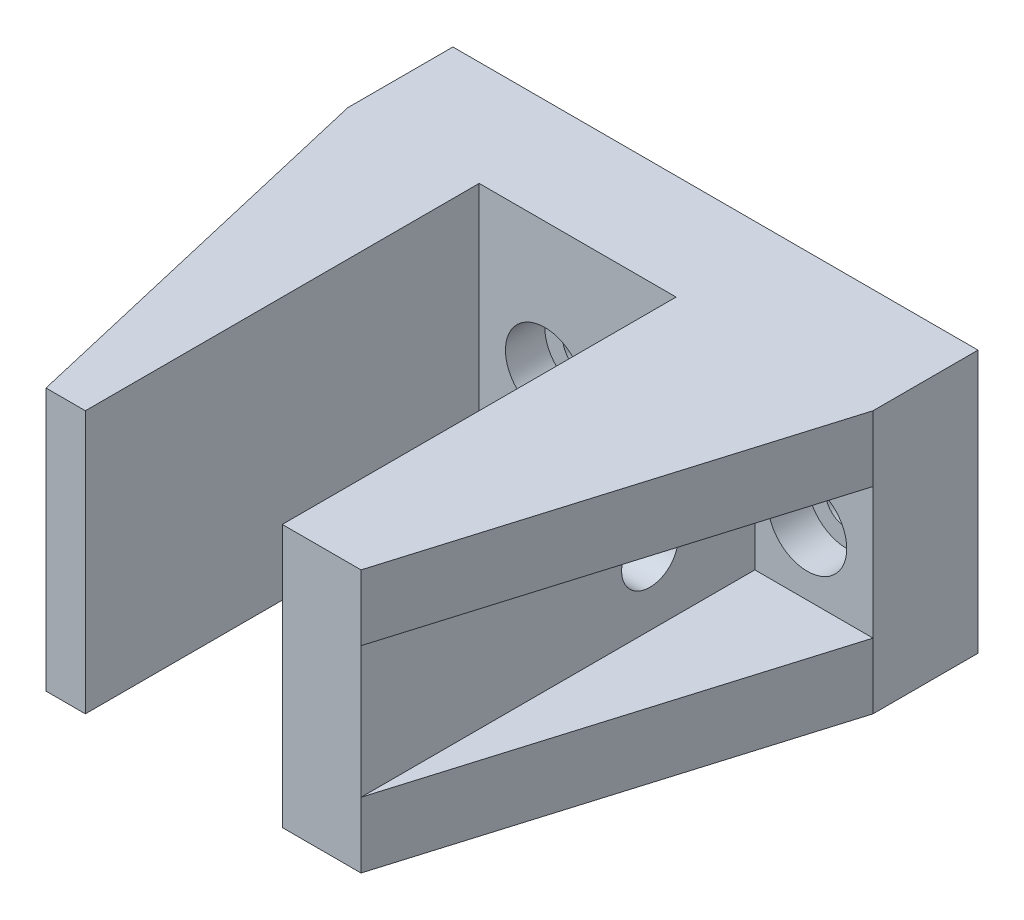
ISO-10303-21;
HEADER;
FILE_DESCRIPTION(('STEP AP214'),'2;1');
FILE_NAME('part.step','',(''),(''),'','','');
FILE_SCHEMA(('AUTOMOTIVE_DESIGN { 1 0 10303 214 1 1 1 1 }'));
ENDSEC;
DATA;
#1=APPLICATION_CONTEXT('core data for automotive mechanical design processes');
#2=APPLICATION_PROTOCOL_DEFINITION('international standard','automotive_design',2000,#1);
#3=PRODUCT_CONTEXT('',#1,'mechanical');
#4=PRODUCT('Part','Part','',(#3));
#5=PRODUCT_RELATED_PRODUCT_CATEGORY('part','',(#4));
#6=PRODUCT_DEFINITION_FORMATION('','',#4);
#7=PRODUCT_DEFINITION_CONTEXT('part definition',#1,'design');
#8=PRODUCT_DEFINITION('design','',#6,#7);
#9=PRODUCT_DEFINITION_SHAPE('','',#8);
#10=(LENGTH_UNIT() NAMED_UNIT(*) SI_UNIT(.MILLI.,.METRE.));
#11=(NAMED_UNIT(*) PLANE_ANGLE_UNIT() SI_UNIT($,.RADIAN.));
#12=(NAMED_UNIT(*) SI_UNIT($,.STERADIAN.) SOLID_ANGLE_UNIT());
#13=UNCERTAINTY_MEASURE_WITH_UNIT(LENGTH_MEASURE(1.E-05),#10,'distance_accuracy_value','');
#14=(GEOMETRIC_REPRESENTATION_CONTEXT(3) GLOBAL_UNCERTAINTY_ASSIGNED_CONTEXT((#13)) GLOBAL_UNIT_ASSIGNED_CONTEXT((#10,
#11,#12)) REPRESENTATION_CONTEXT('',''));
#15=CARTESIAN_POINT('',(0.,0.,0.));
#16=DIRECTION('',(0.,0.,1.));
#17=DIRECTION('',(1.,0.,0.));
#18=AXIS2_PLACEMENT_3D('',#15,#16,#17);
#19=CARTESIAN_POINT('',(-5.,0.,8.));
#20=DIRECTION('',(0.,0.,-1.));
#21=DIRECTION('',(-1.,0.,0.));
#22=AXIS2_PLACEMENT_3D('',#19,#20,#21);
#23=CYLINDRICAL_SURFACE('',#22,1.65);
#24=CARTESIAN_POINT('',(-5.,0.,0.));
#25=DIRECTION('',(0.,0.,1.));
#26=DIRECTION('',(1.,0.,0.));
#27=AXIS2_PLACEMENT_3D('',#24,#25,#26);
#28=CIRCLE('',#27,1.65);
#29=CARTESIAN_POINT('',(-3.35,0.,0.));
#30=VERTEX_POINT('',#29);
#31=EDGE_CURVE('E399',#30,#30,#28,.T.);
#32=ORIENTED_EDGE('',*,*,#31,.F.);
#33=EDGE_LOOP('',(#32));
#34=FACE_BOUND('',#33,.T.);
#35=CARTESIAN_POINT('',(-5.,0.,5.));
#36=DIRECTION('',(0.,0.,1.));
#37=DIRECTION('',(1.,0.,0.));
#38=AXIS2_PLACEMENT_3D('',#35,#36,#37);
#39=CIRCLE('',#38,1.65);
#40=CARTESIAN_POINT('',(-3.35,0.,5.));
#41=VERTEX_POINT('',#40);
#42=EDGE_CURVE('E49',#41,#41,#39,.T.);
#43=ORIENTED_EDGE('',*,*,#42,.T.);
#44=EDGE_LOOP('',(#43));
#45=FACE_BOUND('',#44,.T.);
#46=ADVANCED_FACE('F45',(#34,#45),#23,.F.);
#47=CARTESIAN_POINT('',(14.9997781888357,-0.0941934040751454,8.));
#48=DIRECTION('',(0.,0.,-1.));
#49=DIRECTION('',(-1.,0.,0.));
#50=AXIS2_PLACEMENT_3D('',#47,#48,#49);
#51=CYLINDRICAL_SURFACE('',#50,1.65);
#52=CARTESIAN_POINT('',(14.9997781888357,-0.0941934040751454,0.));
#53=DIRECTION('',(0.,0.,1.));
#54=DIRECTION('',(1.,0.,0.));
#55=AXIS2_PLACEMENT_3D('',#52,#53,#54);
#56=CIRCLE('',#55,1.65);
#57=CARTESIAN_POINT('',(16.6497781888357,-0.0941934040751454,0.));
#58=VERTEX_POINT('',#57);
#59=EDGE_CURVE('E395',#58,#58,#56,.T.);
#60=ORIENTED_EDGE('',*,*,#59,.F.);
#61=EDGE_LOOP('',(#60));
#62=FACE_BOUND('',#61,.T.);
#63=CARTESIAN_POINT('',(14.9997781888357,-0.0941934040751454,5.));
#64=DIRECTION('',(0.,0.,1.));
#65=DIRECTION('',(1.,0.,0.));
#66=AXIS2_PLACEMENT_3D('',#63,#64,#65);
#67=CIRCLE('',#66,1.65);
#68=CARTESIAN_POINT('',(16.6497781888357,-0.0941934040751454,5.));
#69=VERTEX_POINT('',#68);
#70=EDGE_CURVE('E459',#69,#69,#67,.T.);
#71=ORIENTED_EDGE('',*,*,#70,.T.);
#72=EDGE_LOOP('',(#71));
#73=FACE_BOUND('',#72,.T.);
#74=ADVANCED_FACE('F502',(#62,#73),#51,.F.);
#75=CARTESIAN_POINT('',(-1.0811183182043,0.,16.));
#76=DIRECTION('',(1.,0.,0.));
#77=DIRECTION('',(0.,1.,0.));
#78=AXIS2_PLACEMENT_3D('',#75,#76,#77);
#79=CYLINDRICAL_SURFACE('',#78,2.15);
#80=CARTESIAN_POINT('',(11.,0.,16.));
#81=DIRECTION('',(1.,0.,0.));
#82=DIRECTION('',(0.,1.,0.));
#83=AXIS2_PLACEMENT_3D('',#80,#81,#82);
#84=CIRCLE('',#83,2.15);
#85=CARTESIAN_POINT('',(11.,2.15,16.));
#86=VERTEX_POINT('',#85);
#87=EDGE_CURVE('E274',#86,#86,#84,.T.);
#88=ORIENTED_EDGE('',*,*,#87,.T.);
#89=EDGE_LOOP('',(#88));
#90=FACE_BOUND('',#89,.T.);
#91=CARTESIAN_POINT('',(7.5,0.,16.));
#92=DIRECTION('',(-1.,0.,0.));
#93=DIRECTION('',(0.,0.,1.));
#94=AXIS2_PLACEMENT_3D('',#91,#92,#93);
#95=CIRCLE('',#94,2.15);
#96=CARTESIAN_POINT('',(7.5,0.,18.15));
#97=VERTEX_POINT('',#96);
#98=EDGE_CURVE('E262',#97,#97,#95,.F.);
#99=ORIENTED_EDGE('',*,*,#98,.F.);
#100=EDGE_LOOP('',(#99));
#101=FACE_BOUND('',#100,.T.);
#102=ADVANCED_FACE('F508',(#90,#101),#79,.F.);
#103=CARTESIAN_POINT('',(-20.,-41.3209195267317,8.));
#104=DIRECTION('',(-0.973841209741793,0.,0.227229615606418));
#105=DIRECTION('',(0.227229615606418,0.,0.973841209741793));
#106=AXIS2_PLACEMENT_3D('',#103,#104,#105);
#107=PLANE('',#106);
#108=DIRECTION('',(0.227229615606418,0.,0.973841209741793));
#109=VECTOR('',#108,1.);
#110=CARTESIAN_POINT('',(-20.,-5.,8.));
#111=LINE('',#110,#109);
#112=CARTESIAN_POINT('',(-20.,-5.00000000000001,8.));
#113=VERTEX_POINT('',#112);
#114=CARTESIAN_POINT('',(-13.,-5.00000000000001,38.));
#115=VERTEX_POINT('',#114);
#116=EDGE_CURVE('E11',#113,#115,#111,.T.);
#117=ORIENTED_EDGE('',*,*,#116,.F.);
#118=DIRECTION('',(0.,-1.,0.));
#119=VECTOR('',#118,1.);
#120=CARTESIAN_POINT('',(-20.,-10.,8.));
#121=LINE('',#120,#119);
#122=CARTESIAN_POINT('',(-20.,-10.,8.));
#123=VERTEX_POINT('',#122);
#124=EDGE_CURVE('E409',#113,#123,#121,.T.);
#125=ORIENTED_EDGE('',*,*,#124,.T.);
#126=DIRECTION('',(-0.227229615606418,0.,-0.973841209741793));
#127=VECTOR('',#126,1.);
#128=CARTESIAN_POINT('',(-20.,-10.,8.));
#129=LINE('',#128,#127);
#130=CARTESIAN_POINT('',(-13.,-9.99999999999999,38.));
#131=VERTEX_POINT('',#130);
#132=EDGE_CURVE('E336',#131,#123,#129,.T.);
#133=ORIENTED_EDGE('',*,*,#132,.F.);
#134=DIRECTION('',(0.,-1.,0.));
#135=VECTOR('',#134,1.);
#136=CARTESIAN_POINT('',(-13.,-9.99999999999999,38.));
#137=LINE('',#136,#135);
#138=EDGE_CURVE('E376',#115,#131,#137,.T.);
#139=ORIENTED_EDGE('',*,*,#138,.F.);
#140=EDGE_LOOP('',(#117,#125,#133,#139));
#141=FACE_BOUND('',#140,.T.);
#142=ADVANCED_FACE('F575',(#141),#107,.T.);
#143=CARTESIAN_POINT('',(11.,-41.3209195267317,38.));
#144=DIRECTION('',(0.957826285221151,0.,0.287347885566346));
#145=DIRECTION('',(0.287347885566346,0.,-0.957826285221152));
#146=AXIS2_PLACEMENT_3D('',#143,#144,#145);
#147=PLANE('',#146);
#148=DIRECTION('',(-0.287347885566346,0.,0.957826285221152));
#149=VECTOR('',#148,1.);
#150=CARTESIAN_POINT('',(11.,5.,38.));
#151=LINE('',#150,#149);
#152=CARTESIAN_POINT('',(20.,5.,8.));
#153=VERTEX_POINT('',#152);
#154=CARTESIAN_POINT('',(11.,5.,38.));
#155=VERTEX_POINT('',#154);
#156=EDGE_CURVE('E452',#153,#155,#151,.T.);
#157=ORIENTED_EDGE('',*,*,#156,.F.);
#158=DIRECTION('',(0.,1.,0.));
#159=VECTOR('',#158,1.);
#160=CARTESIAN_POINT('',(20.,-10.,8.));
#161=LINE('',#160,#159);
#162=CARTESIAN_POINT('',(20.,10.,8.));
#163=VERTEX_POINT('',#162);
#164=EDGE_CURVE('E412',#153,#163,#161,.T.);
#165=ORIENTED_EDGE('',*,*,#164,.T.);
#166=DIRECTION('',(0.287347885566346,0.,-0.957826285221151));
#167=VECTOR('',#166,1.);
#168=CARTESIAN_POINT('',(11.,10.,38.));
#169=LINE('',#168,#167);
#170=CARTESIAN_POINT('',(11.,10.,38.));
#171=VERTEX_POINT('',#170);
#172=EDGE_CURVE('E326',#171,#163,#169,.T.);
#173=ORIENTED_EDGE('',*,*,#172,.F.);
#174=DIRECTION('',(0.,1.,0.));
#175=VECTOR('',#174,1.);
#176=CARTESIAN_POINT('',(11.,-10.,38.));
#177=LINE('',#176,#175);
#178=EDGE_CURVE('E364',#155,#171,#177,.T.);
#179=ORIENTED_EDGE('',*,*,#178,.F.);
#180=EDGE_LOOP('',(#157,#165,#173,#179));
#181=FACE_BOUND('',#180,.T.);
#182=ADVANCED_FACE('F519',(#181),#147,.T.);
#183=CARTESIAN_POINT('',(0.,0.,8.));
#184=DIRECTION('',(0.,0.,1.));
#185=DIRECTION('',(1.,0.,0.));
#186=AXIS2_PLACEMENT_3D('',#183,#184,#185);
#187=PLANE('',#186);
#188=CARTESIAN_POINT('',(-5.,0.,8.));
#189=DIRECTION('',(0.,0.,1.));
#190=DIRECTION('',(1.,0.,0.));
#191=AXIS2_PLACEMENT_3D('',#188,#189,#190);
#192=CIRCLE('',#191,3.);
#193=CARTESIAN_POINT('',(-2.,0.,8.));
#194=VERTEX_POINT('',#193);
#195=EDGE_CURVE('E469',#194,#194,#192,.T.);
#196=ORIENTED_EDGE('',*,*,#195,.F.);
#197=EDGE_LOOP('',(#196));
#198=FACE_BOUND('',#197,.T.);
#199=DIRECTION('',(1.,0.,0.));
#200=VECTOR('',#199,1.);
#201=CARTESIAN_POINT('',(20.,-10.,8.));
#202=LINE('',#201,#200);
#203=CARTESIAN_POINT('',(-10.,-10.,8.));
#204=VERTEX_POINT('',#203);
#205=CARTESIAN_POINT('',(5.,-10.,8.));
#206=VERTEX_POINT('',#205);
#207=EDGE_CURVE('E408',#204,#206,#202,.T.);
#208=ORIENTED_EDGE('',*,*,#207,.T.);
#209=DIRECTION('',(0.,-1.,0.));
#210=VECTOR('',#209,1.);
#211=CARTESIAN_POINT('',(5.,-10.,8.));
#212=LINE('',#211,#210);
#213=CARTESIAN_POINT('',(5.,10.,8.));
#214=VERTEX_POINT('',#213);
#215=EDGE_CURVE('E349',#214,#206,#212,.T.);
#216=ORIENTED_EDGE('',*,*,#215,.F.);
#217=DIRECTION('',(-1.,0.,0.));
#218=VECTOR('',#217,1.);
#219=CARTESIAN_POINT('',(20.,10.,8.));
#220=LINE('',#219,#218);
#221=CARTESIAN_POINT('',(-10.,10.,8.));
#222=VERTEX_POINT('',#221);
#223=EDGE_CURVE('E417',#214,#222,#220,.T.);
#224=ORIENTED_EDGE('',*,*,#223,.T.);
#225=DIRECTION('',(0.,1.,0.));
#226=VECTOR('',#225,1.);
#227=CARTESIAN_POINT('',(-10.,-9.99999999999999,8.));
#228=LINE('',#227,#226);
#229=EDGE_CURVE('E353',#204,#222,#228,.T.);
#230=ORIENTED_EDGE('',*,*,#229,.F.);
#231=EDGE_LOOP('',(#208,#216,#224,#230));
#232=FACE_BOUND('',#231,.T.);
#233=ADVANCED_FACE('F515',(#198,#232),#187,.T.);
#234=CARTESIAN_POINT('',(0.,0.,0.));
#235=DIRECTION('',(0.,0.,1.));
#236=DIRECTION('',(1.,0.,0.));
#237=AXIS2_PLACEMENT_3D('',#234,#235,#236);
#238=PLANE('',#237);
#239=DIRECTION('',(0.,-1.,0.));
#240=VECTOR('',#239,1.);
#241=CARTESIAN_POINT('',(-20.,-10.,0.));
#242=LINE('',#241,#240);
#243=CARTESIAN_POINT('',(-20.,9.99999999999999,0.));
#244=VERTEX_POINT('',#243);
#245=CARTESIAN_POINT('',(-20.,-10.,0.));
#246=VERTEX_POINT('',#245);
#247=EDGE_CURVE('E403',#244,#246,#242,.T.);
#248=ORIENTED_EDGE('',*,*,#247,.F.);
#249=DIRECTION('',(-1.,0.,0.));
#250=VECTOR('',#249,1.);
#251=CARTESIAN_POINT('',(20.,10.,0.));
#252=LINE('',#251,#250);
#253=CARTESIAN_POINT('',(20.,10.,0.));
#254=VERTEX_POINT('',#253);
#255=EDGE_CURVE('E430',#254,#244,#252,.T.);
#256=ORIENTED_EDGE('',*,*,#255,.F.);
#257=DIRECTION('',(0.,1.,0.));
#258=VECTOR('',#257,1.);
#259=CARTESIAN_POINT('',(20.,-10.,0.));
#260=LINE('',#259,#258);
#261=CARTESIAN_POINT('',(20.,-10.,0.));
#262=VERTEX_POINT('',#261);
#263=EDGE_CURVE('E427',#262,#254,#260,.T.);
#264=ORIENTED_EDGE('',*,*,#263,.F.);
#265=DIRECTION('',(1.,0.,0.));
#266=VECTOR('',#265,1.);
#267=CARTESIAN_POINT('',(20.,-10.,0.));
#268=LINE('',#267,#266);
#269=EDGE_CURVE('E424',#246,#262,#268,.T.);
#270=ORIENTED_EDGE('',*,*,#269,.F.);
#271=EDGE_LOOP('',(#248,#256,#264,#270));
#272=FACE_BOUND('',#271,.T.);
#273=ORIENTED_EDGE('',*,*,#31,.T.);
#274=EDGE_LOOP('',(#273));
#275=FACE_BOUND('',#274,.T.);
#276=ORIENTED_EDGE('',*,*,#59,.T.);
#277=EDGE_LOOP('',(#276));
#278=FACE_BOUND('',#277,.T.);
#279=ADVANCED_FACE('F518',(#272,#275,#278),#238,.F.);
#280=CARTESIAN_POINT('',(-20.,-10.,8.));
#281=DIRECTION('',(1.,0.,0.));
#282=DIRECTION('',(0.,0.,-1.));
#283=AXIS2_PLACEMENT_3D('',#280,#281,#282);
#284=PLANE('',#283);
#285=ORIENTED_EDGE('',*,*,#247,.T.);
#286=DIRECTION('',(0.,0.,-1.));
#287=VECTOR('',#286,1.);
#288=CARTESIAN_POINT('',(-20.,-10.,8.));
#289=LINE('',#288,#287);
#290=EDGE_CURVE('E444',#123,#246,#289,.T.);
#291=ORIENTED_EDGE('',*,*,#290,.F.);
#292=ORIENTED_EDGE('',*,*,#124,.F.);
#293=DIRECTION('',(0.,1.,0.));
#294=VECTOR('',#293,1.);
#295=CARTESIAN_POINT('',(-20.,4.99999999999999,8.));
#296=LINE('',#295,#294);
#297=CARTESIAN_POINT('',(-20.,4.99999999999999,8.));
#298=VERTEX_POINT('',#297);
#299=EDGE_CURVE('E279',#113,#298,#296,.T.);
#300=ORIENTED_EDGE('',*,*,#299,.T.);
#301=CARTESIAN_POINT('',(-20.,9.99999999999999,8.));
#302=VERTEX_POINT('',#301);
#303=EDGE_CURVE('E404',#302,#298,#121,.T.);
#304=ORIENTED_EDGE('',*,*,#303,.F.);
#305=DIRECTION('',(0.,0.,-1.));
#306=VECTOR('',#305,1.);
#307=CARTESIAN_POINT('',(-20.,9.99999999999999,8.));
#308=LINE('',#307,#306);
#309=EDGE_CURVE('E420',#302,#244,#308,.T.);
#310=ORIENTED_EDGE('',*,*,#309,.T.);
#311=EDGE_LOOP('',(#285,#291,#292,#300,#304,#310));
#312=FACE_BOUND('',#311,.T.);
#313=ADVANCED_FACE('F47',(#312),#284,.F.);
#314=CARTESIAN_POINT('',(20.,-10.,8.));
#315=DIRECTION('',(0.,1.,0.));
#316=DIRECTION('',(-1.,0.,0.));
#317=AXIS2_PLACEMENT_3D('',#314,#315,#316);
#318=PLANE('',#317);
#319=DIRECTION('',(0.,0.,-1.));
#320=VECTOR('',#319,1.);
#321=CARTESIAN_POINT('',(20.,-10.,8.));
#322=LINE('',#321,#320);
#323=CARTESIAN_POINT('',(20.,-10.,8.));
#324=VERTEX_POINT('',#323);
#325=EDGE_CURVE('E440',#324,#262,#322,.T.);
#326=ORIENTED_EDGE('',*,*,#325,.F.);
#327=DIRECTION('',(-0.287347885566346,0.,0.957826285221152));
#328=VECTOR('',#327,1.);
#329=CARTESIAN_POINT('',(11.,-10.,38.));
#330=LINE('',#329,#328);
#331=CARTESIAN_POINT('',(11.,-10.,38.));
#332=VERTEX_POINT('',#331);
#333=EDGE_CURVE('E303',#324,#332,#330,.T.);
#334=ORIENTED_EDGE('',*,*,#333,.T.);
#335=DIRECTION('',(1.,0.,0.));
#336=VECTOR('',#335,1.);
#337=CARTESIAN_POINT('',(5.,-10.,38.));
#338=LINE('',#337,#336);
#339=CARTESIAN_POINT('',(5.,-10.,38.));
#340=VERTEX_POINT('',#339);
#341=EDGE_CURVE('E348',#340,#332,#338,.T.);
#342=ORIENTED_EDGE('',*,*,#341,.F.);
#343=DIRECTION('',(0.,0.,-1.));
#344=VECTOR('',#343,1.);
#345=CARTESIAN_POINT('',(5.,-10.,38.));
#346=LINE('',#345,#344);
#347=EDGE_CURVE('E344',#340,#206,#346,.T.);
#348=ORIENTED_EDGE('',*,*,#347,.T.);
#349=ORIENTED_EDGE('',*,*,#207,.F.);
#350=DIRECTION('',(0.,0.,-1.));
#351=VECTOR('',#350,1.);
#352=CARTESIAN_POINT('',(-10.,-9.99999999999999,38.));
#353=LINE('',#352,#351);
#354=CARTESIAN_POINT('',(-10.,-9.99999999999999,38.));
#355=VERTEX_POINT('',#354);
#356=EDGE_CURVE('E384',#355,#204,#353,.T.);
#357=ORIENTED_EDGE('',*,*,#356,.F.);
#358=DIRECTION('',(1.,0.,0.));
#359=VECTOR('',#358,1.);
#360=CARTESIAN_POINT('',(-13.,-9.99999999999999,38.));
#361=LINE('',#360,#359);
#362=EDGE_CURVE('E381',#131,#355,#361,.T.);
#363=ORIENTED_EDGE('',*,*,#362,.F.);
#364=ORIENTED_EDGE('',*,*,#132,.T.);
#365=ORIENTED_EDGE('',*,*,#290,.T.);
#366=ORIENTED_EDGE('',*,*,#269,.T.);
#367=EDGE_LOOP('',(#326,#334,#342,#348,#349,#357,#363,#364,#365,#366));
#368=FACE_BOUND('',#367,.T.);
#369=ADVANCED_FACE('F531',(#368),#318,.F.);
#370=CARTESIAN_POINT('',(20.,-10.,8.));
#371=DIRECTION('',(-1.,0.,0.));
#372=DIRECTION('',(0.,0.,1.));
#373=AXIS2_PLACEMENT_3D('',#370,#371,#372);
#374=PLANE('',#373);
#375=ORIENTED_EDGE('',*,*,#263,.T.);
#376=DIRECTION('',(0.,0.,-1.));
#377=VECTOR('',#376,1.);
#378=CARTESIAN_POINT('',(20.,10.,8.));
#379=LINE('',#378,#377);
#380=EDGE_CURVE('E436',#163,#254,#379,.T.);
#381=ORIENTED_EDGE('',*,*,#380,.F.);
#382=ORIENTED_EDGE('',*,*,#164,.F.);
#383=DIRECTION('',(0.,-1.,0.));
#384=VECTOR('',#383,1.);
#385=CARTESIAN_POINT('',(20.,5.,8.));
#386=LINE('',#385,#384);
#387=CARTESIAN_POINT('',(20.,-5.,8.));
#388=VERTEX_POINT('',#387);
#389=EDGE_CURVE('E314',#153,#388,#386,.T.);
#390=ORIENTED_EDGE('',*,*,#389,.T.);
#391=EDGE_CURVE('E413',#324,#388,#161,.T.);
#392=ORIENTED_EDGE('',*,*,#391,.F.);
#393=ORIENTED_EDGE('',*,*,#325,.T.);
#394=EDGE_LOOP('',(#375,#381,#382,#390,#392,#393));
#395=FACE_BOUND('',#394,.T.);
#396=ADVANCED_FACE('F528',(#395),#374,.F.);
#397=CARTESIAN_POINT('',(20.,10.,8.));
#398=DIRECTION('',(0.,-1.,0.));
#399=DIRECTION('',(1.,0.,0.));
#400=AXIS2_PLACEMENT_3D('',#397,#398,#399);
#401=PLANE('',#400);
#402=ORIENTED_EDGE('',*,*,#309,.F.);
#403=DIRECTION('',(0.227229615606418,0.,0.973841209741793));
#404=VECTOR('',#403,1.);
#405=CARTESIAN_POINT('',(-20.,9.99999999999999,8.));
#406=LINE('',#405,#404);
#407=CARTESIAN_POINT('',(-13.,9.99999999999999,38.));
#408=VERTEX_POINT('',#407);
#409=EDGE_CURVE('E330',#302,#408,#406,.T.);
#410=ORIENTED_EDGE('',*,*,#409,.T.);
#411=DIRECTION('',(-1.,0.,0.));
#412=VECTOR('',#411,1.);
#413=CARTESIAN_POINT('',(-13.,10.,38.));
#414=LINE('',#413,#412);
#415=CARTESIAN_POINT('',(-10.,10.,38.));
#416=VERTEX_POINT('',#415);
#417=EDGE_CURVE('E372',#416,#408,#414,.T.);
#418=ORIENTED_EDGE('',*,*,#417,.F.);
#419=DIRECTION('',(0.,0.,-1.));
#420=VECTOR('',#419,1.);
#421=CARTESIAN_POINT('',(-10.,10.,38.));
#422=LINE('',#421,#420);
#423=EDGE_CURVE('E391',#416,#222,#422,.T.);
#424=ORIENTED_EDGE('',*,*,#423,.T.);
#425=ORIENTED_EDGE('',*,*,#223,.F.);
#426=DIRECTION('',(0.,0.,-1.));
#427=VECTOR('',#426,1.);
#428=CARTESIAN_POINT('',(5.,10.,38.));
#429=LINE('',#428,#427);
#430=CARTESIAN_POINT('',(5.,10.,38.));
#431=VERTEX_POINT('',#430);
#432=EDGE_CURVE('E340',#431,#214,#429,.T.);
#433=ORIENTED_EDGE('',*,*,#432,.F.);
#434=DIRECTION('',(-1.,0.,0.));
#435=VECTOR('',#434,1.);
#436=CARTESIAN_POINT('',(5.,10.,38.));
#437=LINE('',#436,#435);
#438=EDGE_CURVE('E361',#171,#431,#437,.T.);
#439=ORIENTED_EDGE('',*,*,#438,.F.);
#440=ORIENTED_EDGE('',*,*,#172,.T.);
#441=ORIENTED_EDGE('',*,*,#380,.T.);
#442=ORIENTED_EDGE('',*,*,#255,.T.);
#443=EDGE_LOOP('',(#402,#410,#418,#424,#425,#433,#439,#440,#441,#442));
#444=FACE_BOUND('',#443,.T.);
#445=ADVANCED_FACE('F524',(#444),#401,.F.);
#446=CARTESIAN_POINT('',(-10.,-9.99999999999999,38.));
#447=DIRECTION('',(-1.,0.,0.));
#448=DIRECTION('',(0.,0.,1.));
#449=AXIS2_PLACEMENT_3D('',#446,#447,#448);
#450=PLANE('',#449);
#451=ORIENTED_EDGE('',*,*,#229,.T.);
#452=ORIENTED_EDGE('',*,*,#423,.F.);
#453=DIRECTION('',(0.,1.,0.));
#454=VECTOR('',#453,1.);
#455=CARTESIAN_POINT('',(-10.,-9.99999999999999,38.));
#456=LINE('',#455,#454);
#457=EDGE_CURVE('E368',#355,#416,#456,.T.);
#458=ORIENTED_EDGE('',*,*,#457,.F.);
#459=ORIENTED_EDGE('',*,*,#356,.T.);
#460=EDGE_LOOP('',(#451,#452,#458,#459));
#461=FACE_BOUND('',#460,.T.);
#462=ADVANCED_FACE('F527',(#461),#450,.F.);
#463=CARTESIAN_POINT('',(0.,0.,38.));
#464=DIRECTION('',(0.,0.,-1.));
#465=DIRECTION('',(-1.,0.,0.));
#466=AXIS2_PLACEMENT_3D('',#463,#464,#465);
#467=PLANE('',#466);
#468=ORIENTED_EDGE('',*,*,#457,.T.);
#469=ORIENTED_EDGE('',*,*,#417,.T.);
#470=CARTESIAN_POINT('',(-13.,4.99999999999999,38.));
#471=VERTEX_POINT('',#470);
#472=EDGE_CURVE('E377',#408,#471,#137,.T.);
#473=ORIENTED_EDGE('',*,*,#472,.T.);
#474=DIRECTION('',(0.,1.,0.));
#475=VECTOR('',#474,1.);
#476=CARTESIAN_POINT('',(-13.,4.99999999999999,38.));
#477=LINE('',#476,#475);
#478=EDGE_CURVE('E290',#115,#471,#477,.T.);
#479=ORIENTED_EDGE('',*,*,#478,.F.);
#480=ORIENTED_EDGE('',*,*,#138,.T.);
#481=ORIENTED_EDGE('',*,*,#362,.T.);
#482=EDGE_LOOP('',(#468,#469,#473,#479,#480,#481));
#483=FACE_BOUND('',#482,.T.);
#484=ADVANCED_FACE('F569',(#483),#467,.F.);
#485=CARTESIAN_POINT('',(5.,-10.,38.));
#486=DIRECTION('',(1.,0.,0.));
#487=DIRECTION('',(0.,0.,-1.));
#488=AXIS2_PLACEMENT_3D('',#485,#486,#487);
#489=PLANE('',#488);
#490=DIRECTION('',(0.,0.5,-0.866025403784439));
#491=VECTOR('',#490,1.);
#492=CARTESIAN_POINT('',(5.,2.04959345562317,19.55));
#493=LINE('',#492,#491);
#494=CARTESIAN_POINT('',(5.,2.04959345562317,19.55));
#495=VERTEX_POINT('',#494);
#496=CARTESIAN_POINT('',(5.,4.09918691124634,16.));
#497=VERTEX_POINT('',#496);
#498=EDGE_CURVE('E245',#495,#497,#493,.T.);
#499=ORIENTED_EDGE('',*,*,#498,.F.);
#500=DIRECTION('',(0.,1.,0.));
#501=VECTOR('',#500,1.);
#502=CARTESIAN_POINT('',(5.,-2.04959345562317,19.55));
#503=LINE('',#502,#501);
#504=CARTESIAN_POINT('',(5.,-2.04959345562317,19.55));
#505=VERTEX_POINT('',#504);
#506=EDGE_CURVE('E63',#505,#495,#503,.T.);
#507=ORIENTED_EDGE('',*,*,#506,.F.);
#508=DIRECTION('',(0.,0.5,0.866025403784438));
#509=VECTOR('',#508,1.);
#510=CARTESIAN_POINT('',(5.,-4.09918691124634,16.));
#511=LINE('',#510,#509);
#512=CARTESIAN_POINT('',(5.,-4.09918691124634,16.));
#513=VERTEX_POINT('',#512);
#514=EDGE_CURVE('E222',#513,#505,#511,.T.);
#515=ORIENTED_EDGE('',*,*,#514,.F.);
#516=DIRECTION('',(0.,-0.5,0.866025403784439));
#517=VECTOR('',#516,1.);
#518=CARTESIAN_POINT('',(5.,-2.04959345562317,12.45));
#519=LINE('',#518,#517);
#520=CARTESIAN_POINT('',(5.,-2.04959345562317,12.45));
#521=VERTEX_POINT('',#520);
#522=EDGE_CURVE('E226',#521,#513,#519,.T.);
#523=ORIENTED_EDGE('',*,*,#522,.F.);
#524=DIRECTION('',(0.,-1.,0.));
#525=VECTOR('',#524,1.);
#526=CARTESIAN_POINT('',(5.,2.04959345562317,12.45));
#527=LINE('',#526,#525);
#528=CARTESIAN_POINT('',(5.,2.04959345562317,12.45));
#529=VERTEX_POINT('',#528);
#530=EDGE_CURVE('E252',#529,#521,#527,.T.);
#531=ORIENTED_EDGE('',*,*,#530,.F.);
#532=DIRECTION('',(0.,-0.5,-0.866025403784439));
#533=VECTOR('',#532,1.);
#534=CARTESIAN_POINT('',(5.,4.09918691124634,16.));
#535=LINE('',#534,#533);
#536=EDGE_CURVE('E248',#497,#529,#535,.T.);
#537=ORIENTED_EDGE('',*,*,#536,.F.);
#538=EDGE_LOOP('',(#499,#507,#515,#523,#531,#537));
#539=FACE_BOUND('',#538,.T.);
#540=ORIENTED_EDGE('',*,*,#215,.T.);
#541=ORIENTED_EDGE('',*,*,#347,.F.);
#542=DIRECTION('',(0.,-1.,0.));
#543=VECTOR('',#542,1.);
#544=CARTESIAN_POINT('',(5.,-10.,38.));
#545=LINE('',#544,#543);
#546=EDGE_CURVE('E358',#431,#340,#545,.T.);
#547=ORIENTED_EDGE('',*,*,#546,.F.);
#548=ORIENTED_EDGE('',*,*,#432,.T.);
#549=EDGE_LOOP('',(#540,#541,#547,#548));
#550=FACE_BOUND('',#549,.T.);
#551=ADVANCED_FACE('F558',(#539,#550),#489,.F.);
#552=CARTESIAN_POINT('',(0.,0.,38.));
#553=DIRECTION('',(0.,0.,-1.));
#554=DIRECTION('',(-1.,0.,0.));
#555=AXIS2_PLACEMENT_3D('',#552,#553,#554);
#556=PLANE('',#555);
#557=CARTESIAN_POINT('',(11.,-5.,38.));
#558=VERTEX_POINT('',#557);
#559=EDGE_CURVE('E354',#332,#558,#177,.T.);
#560=ORIENTED_EDGE('',*,*,#559,.T.);
#561=DIRECTION('',(0.,-1.,0.));
#562=VECTOR('',#561,1.);
#563=CARTESIAN_POINT('',(11.,5.,38.));
#564=LINE('',#563,#562);
#565=EDGE_CURVE('E295',#155,#558,#564,.T.);
#566=ORIENTED_EDGE('',*,*,#565,.F.);
#567=ORIENTED_EDGE('',*,*,#178,.T.);
#568=ORIENTED_EDGE('',*,*,#438,.T.);
#569=ORIENTED_EDGE('',*,*,#546,.T.);
#570=ORIENTED_EDGE('',*,*,#341,.T.);
#571=EDGE_LOOP('',(#560,#566,#567,#568,#569,#570));
#572=FACE_BOUND('',#571,.T.);
#573=ADVANCED_FACE('F552',(#572),#556,.F.);
#574=DIRECTION('',(-0.227229615606418,0.,-0.973841209741793));
#575=VECTOR('',#574,1.);
#576=CARTESIAN_POINT('',(-20.,4.99999999999999,8.));
#577=LINE('',#576,#575);
#578=EDGE_CURVE('E55',#471,#298,#577,.T.);
#579=ORIENTED_EDGE('',*,*,#578,.F.);
#580=ORIENTED_EDGE('',*,*,#472,.F.);
#581=ORIENTED_EDGE('',*,*,#409,.F.);
#582=ORIENTED_EDGE('',*,*,#303,.T.);
#583=EDGE_LOOP('',(#579,#580,#581,#582));
#584=FACE_BOUND('',#583,.T.);
#585=ADVANCED_FACE('F588',(#584),#107,.T.);
#586=DIRECTION('',(0.287347885566346,0.,-0.957826285221152));
#587=VECTOR('',#586,1.);
#588=CARTESIAN_POINT('',(11.,-5.,38.));
#589=LINE('',#588,#587);
#590=EDGE_CURVE('E448',#558,#388,#589,.T.);
#591=ORIENTED_EDGE('',*,*,#590,.F.);
#592=ORIENTED_EDGE('',*,*,#559,.F.);
#593=ORIENTED_EDGE('',*,*,#333,.F.);
#594=ORIENTED_EDGE('',*,*,#391,.T.);
#595=EDGE_LOOP('',(#591,#592,#593,#594));
#596=FACE_BOUND('',#595,.T.);
#597=ADVANCED_FACE('F549',(#596),#147,.T.);
#598=CARTESIAN_POINT('',(0.,0.,8.));
#599=DIRECTION('',(0.,0.,1.));
#600=DIRECTION('',(1.,0.,0.));
#601=AXIS2_PLACEMENT_3D('',#598,#599,#600);
#602=PLANE('',#601);
#603=CARTESIAN_POINT('',(14.9997781888357,-0.0941934040751454,8.));
#604=DIRECTION('',(0.,0.,1.));
#605=DIRECTION('',(1.,0.,0.));
#606=AXIS2_PLACEMENT_3D('',#603,#604,#605);
#607=CIRCLE('',#606,3.);
#608=CARTESIAN_POINT('',(17.9997781888357,-0.0941934040751454,8.));
#609=VERTEX_POINT('',#608);
#610=EDGE_CURVE('E475',#609,#609,#607,.T.);
#611=ORIENTED_EDGE('',*,*,#610,.F.);
#612=EDGE_LOOP('',(#611));
#613=FACE_BOUND('',#612,.T.);
#614=DIRECTION('',(0.,1.,0.));
#615=VECTOR('',#614,1.);
#616=CARTESIAN_POINT('',(11.,5.,8.));
#617=LINE('',#616,#615);
#618=CARTESIAN_POINT('',(11.,-5.,8.));
#619=VERTEX_POINT('',#618);
#620=CARTESIAN_POINT('',(11.,5.,8.));
#621=VERTEX_POINT('',#620);
#622=EDGE_CURVE('E306',#619,#621,#617,.T.);
#623=ORIENTED_EDGE('',*,*,#622,.F.);
#624=DIRECTION('',(-1.,0.,0.));
#625=VECTOR('',#624,1.);
#626=CARTESIAN_POINT('',(11.,-5.,8.));
#627=LINE('',#626,#625);
#628=EDGE_CURVE('E278',#388,#619,#627,.T.);
#629=ORIENTED_EDGE('',*,*,#628,.F.);
#630=ORIENTED_EDGE('',*,*,#389,.F.);
#631=DIRECTION('',(1.,0.,0.));
#632=VECTOR('',#631,1.);
#633=CARTESIAN_POINT('',(11.,5.,8.));
#634=LINE('',#633,#632);
#635=EDGE_CURVE('E320',#621,#153,#634,.T.);
#636=ORIENTED_EDGE('',*,*,#635,.F.);
#637=EDGE_LOOP('',(#623,#629,#630,#636));
#638=FACE_BOUND('',#637,.T.);
#639=ADVANCED_FACE('F615',(#613,#638),#602,.T.);
#640=CARTESIAN_POINT('',(11.,5.,-5.45362404707372));
#641=DIRECTION('',(-1.,0.,0.));
#642=DIRECTION('',(0.,-1.,0.));
#643=AXIS2_PLACEMENT_3D('',#640,#641,#642);
#644=PLANE('',#643);
#645=ORIENTED_EDGE('',*,*,#87,.F.);
#646=EDGE_LOOP('',(#645));
#647=FACE_BOUND('',#646,.T.);
#648=ORIENTED_EDGE('',*,*,#622,.T.);
#649=DIRECTION('',(0.,0.,1.));
#650=VECTOR('',#649,1.);
#651=CARTESIAN_POINT('',(11.,5.,-5.45362404707372));
#652=LINE('',#651,#650);
#653=EDGE_CURVE('E310',#621,#155,#652,.T.);
#654=ORIENTED_EDGE('',*,*,#653,.T.);
#655=ORIENTED_EDGE('',*,*,#565,.T.);
#656=DIRECTION('',(0.,0.,1.));
#657=VECTOR('',#656,1.);
#658=CARTESIAN_POINT('',(11.,-5.,-5.45362404707372));
#659=LINE('',#658,#657);
#660=EDGE_CURVE('E307',#619,#558,#659,.T.);
#661=ORIENTED_EDGE('',*,*,#660,.F.);
#662=EDGE_LOOP('',(#648,#654,#655,#661));
#663=FACE_BOUND('',#662,.T.);
#664=ADVANCED_FACE('F613',(#647,#663),#644,.F.);
#665=CARTESIAN_POINT('',(11.,5.,-5.45362404707372));
#666=DIRECTION('',(0.,1.,0.));
#667=DIRECTION('',(-1.,0.,0.));
#668=AXIS2_PLACEMENT_3D('',#665,#666,#667);
#669=PLANE('',#668);
#670=ORIENTED_EDGE('',*,*,#156,.T.);
#671=ORIENTED_EDGE('',*,*,#653,.F.);
#672=ORIENTED_EDGE('',*,*,#635,.T.);
#673=EDGE_LOOP('',(#670,#671,#672));
#674=FACE_BOUND('',#673,.T.);
#675=ADVANCED_FACE('F608',(#674),#669,.F.);
#676=CARTESIAN_POINT('',(11.,-5.,-5.45362404707372));
#677=DIRECTION('',(0.,-1.,0.));
#678=DIRECTION('',(1.,0.,0.));
#679=AXIS2_PLACEMENT_3D('',#676,#677,#678);
#680=PLANE('',#679);
#681=ORIENTED_EDGE('',*,*,#590,.T.);
#682=ORIENTED_EDGE('',*,*,#628,.T.);
#683=ORIENTED_EDGE('',*,*,#660,.T.);
#684=EDGE_LOOP('',(#681,#682,#683));
#685=FACE_BOUND('',#684,.T.);
#686=ADVANCED_FACE('F601',(#685),#680,.F.);
#687=CARTESIAN_POINT('',(-13.,4.99999999999999,-5.45362404707372));
#688=DIRECTION('',(1.,0.,0.));
#689=DIRECTION('',(0.,0.,-1.));
#690=AXIS2_PLACEMENT_3D('',#687,#688,#689);
#691=PLANE('',#690);
#692=DIRECTION('',(0.,-1.,0.));
#693=VECTOR('',#692,1.);
#694=CARTESIAN_POINT('',(-13.,4.99999999999999,8.));
#695=LINE('',#694,#693);
#696=CARTESIAN_POINT('',(-13.,4.99999999999999,8.));
#697=VERTEX_POINT('',#696);
#698=CARTESIAN_POINT('',(-13.,-5.00000000000001,8.));
#699=VERTEX_POINT('',#698);
#700=EDGE_CURVE('E287',#697,#699,#695,.T.);
#701=ORIENTED_EDGE('',*,*,#700,.T.);
#702=DIRECTION('',(0.,0.,1.));
#703=VECTOR('',#702,1.);
#704=CARTESIAN_POINT('',(-13.,-5.00000000000001,-5.45362404707372));
#705=LINE('',#704,#703);
#706=EDGE_CURVE('E284',#699,#115,#705,.T.);
#707=ORIENTED_EDGE('',*,*,#706,.T.);
#708=ORIENTED_EDGE('',*,*,#478,.T.);
#709=DIRECTION('',(0.,0.,1.));
#710=VECTOR('',#709,1.);
#711=CARTESIAN_POINT('',(-13.,4.99999999999999,-5.45362404707372));
#712=LINE('',#711,#710);
#713=EDGE_CURVE('E294',#697,#471,#712,.T.);
#714=ORIENTED_EDGE('',*,*,#713,.F.);
#715=EDGE_LOOP('',(#701,#707,#708,#714));
#716=FACE_BOUND('',#715,.T.);
#717=ADVANCED_FACE('F599',(#716),#691,.F.);
#718=CARTESIAN_POINT('',(-13.,-5.00000000000001,-5.45362404707372));
#719=DIRECTION('',(0.,-1.,0.));
#720=DIRECTION('',(0.,0.,-1.));
#721=AXIS2_PLACEMENT_3D('',#718,#719,#720);
#722=PLANE('',#721);
#723=ORIENTED_EDGE('',*,*,#116,.T.);
#724=ORIENTED_EDGE('',*,*,#706,.F.);
#725=DIRECTION('',(-1.,0.,0.));
#726=VECTOR('',#725,1.);
#727=CARTESIAN_POINT('',(-13.,-5.00000000000001,8.));
#728=LINE('',#727,#726);
#729=EDGE_CURVE('E283',#699,#113,#728,.T.);
#730=ORIENTED_EDGE('',*,*,#729,.T.);
#731=EDGE_LOOP('',(#723,#724,#730));
#732=FACE_BOUND('',#731,.T.);
#733=ADVANCED_FACE('F597',(#732),#722,.F.);
#734=CARTESIAN_POINT('',(-13.,4.99999999999999,-5.45362404707372));
#735=DIRECTION('',(0.,1.,0.));
#736=DIRECTION('',(0.,0.,1.));
#737=AXIS2_PLACEMENT_3D('',#734,#735,#736);
#738=PLANE('',#737);
#739=ORIENTED_EDGE('',*,*,#578,.T.);
#740=DIRECTION('',(1.,0.,0.));
#741=VECTOR('',#740,1.);
#742=CARTESIAN_POINT('',(-13.,4.99999999999999,8.));
#743=LINE('',#742,#741);
#744=EDGE_CURVE('E71',#298,#697,#743,.T.);
#745=ORIENTED_EDGE('',*,*,#744,.T.);
#746=ORIENTED_EDGE('',*,*,#713,.T.);
#747=EDGE_LOOP('',(#739,#745,#746));
#748=FACE_BOUND('',#747,.T.);
#749=ADVANCED_FACE('F591',(#748),#738,.F.);
#750=CARTESIAN_POINT('',(0.,0.,8.));
#751=DIRECTION('',(0.,0.,1.));
#752=DIRECTION('',(1.,0.,0.));
#753=AXIS2_PLACEMENT_3D('',#750,#751,#752);
#754=PLANE('',#753);
#755=ORIENTED_EDGE('',*,*,#700,.F.);
#756=ORIENTED_EDGE('',*,*,#744,.F.);
#757=ORIENTED_EDGE('',*,*,#299,.F.);
#758=ORIENTED_EDGE('',*,*,#729,.F.);
#759=EDGE_LOOP('',(#755,#756,#757,#758));
#760=FACE_BOUND('',#759,.T.);
#761=ADVANCED_FACE('F594',(#760),#754,.T.);
#762=CARTESIAN_POINT('',(7.5,0.,0.));
#763=DIRECTION('',(-1.,0.,0.));
#764=DIRECTION('',(0.,0.,1.));
#765=AXIS2_PLACEMENT_3D('',#762,#763,#764);
#766=PLANE('',#765);
#767=DIRECTION('',(0.,1.,0.));
#768=VECTOR('',#767,1.);
#769=CARTESIAN_POINT('',(7.5,-2.04959345562317,19.55));
#770=LINE('',#769,#768);
#771=CARTESIAN_POINT('',(7.5,-2.04959345562317,19.55));
#772=VERTEX_POINT('',#771);
#773=CARTESIAN_POINT('',(7.5,2.04959345562317,19.55));
#774=VERTEX_POINT('',#773);
#775=EDGE_CURVE('E199',#772,#774,#770,.T.);
#776=ORIENTED_EDGE('',*,*,#775,.T.);
#777=DIRECTION('',(0.,0.5,-0.866025403784439));
#778=VECTOR('',#777,1.);
#779=CARTESIAN_POINT('',(7.5,2.04959345562317,19.55));
#780=LINE('',#779,#778);
#781=CARTESIAN_POINT('',(7.5,4.09918691124634,16.));
#782=VERTEX_POINT('',#781);
#783=EDGE_CURVE('E209',#774,#782,#780,.T.);
#784=ORIENTED_EDGE('',*,*,#783,.T.);
#785=DIRECTION('',(0.,-0.5,-0.866025403784439));
#786=VECTOR('',#785,1.);
#787=CARTESIAN_POINT('',(7.5,4.09918691124634,16.));
#788=LINE('',#787,#786);
#789=CARTESIAN_POINT('',(7.5,2.04959345562317,12.45));
#790=VERTEX_POINT('',#789);
#791=EDGE_CURVE('E215',#782,#790,#788,.T.);
#792=ORIENTED_EDGE('',*,*,#791,.T.);
#793=DIRECTION('',(0.,-1.,0.));
#794=VECTOR('',#793,1.);
#795=CARTESIAN_POINT('',(7.5,2.04959345562317,12.45));
#796=LINE('',#795,#794);
#797=CARTESIAN_POINT('',(7.5,-2.04959345562317,12.45));
#798=VERTEX_POINT('',#797);
#799=EDGE_CURVE('E234',#790,#798,#796,.T.);
#800=ORIENTED_EDGE('',*,*,#799,.T.);
#801=DIRECTION('',(0.,-0.5,0.866025403784439));
#802=VECTOR('',#801,1.);
#803=CARTESIAN_POINT('',(7.5,-2.04959345562317,12.45));
#804=LINE('',#803,#802);
#805=CARTESIAN_POINT('',(7.5,-4.09918691124634,16.));
#806=VERTEX_POINT('',#805);
#807=EDGE_CURVE('E238',#798,#806,#804,.T.);
#808=ORIENTED_EDGE('',*,*,#807,.T.);
#809=DIRECTION('',(0.,0.5,0.866025403784438));
#810=VECTOR('',#809,1.);
#811=CARTESIAN_POINT('',(7.5,-4.09918691124634,16.));
#812=LINE('',#811,#810);
#813=EDGE_CURVE('E206',#806,#772,#812,.T.);
#814=ORIENTED_EDGE('',*,*,#813,.T.);
#815=EDGE_LOOP('',(#776,#784,#792,#800,#808,#814));
#816=FACE_BOUND('',#815,.T.);
#817=ORIENTED_EDGE('',*,*,#98,.T.);
#818=EDGE_LOOP('',(#817));
#819=FACE_BOUND('',#818,.T.);
#820=ADVANCED_FACE('F217',(#816,#819),#766,.T.);
#821=CARTESIAN_POINT('',(7.5,-2.04959345562317,19.55));
#822=DIRECTION('',(0.,0.,1.));
#823=DIRECTION('',(1.,0.,0.));
#824=AXIS2_PLACEMENT_3D('',#821,#822,#823);
#825=PLANE('',#824);
#826=ORIENTED_EDGE('',*,*,#506,.T.);
#827=DIRECTION('',(-1.,0.,0.));
#828=VECTOR('',#827,1.);
#829=CARTESIAN_POINT('',(7.5,2.04959345562317,19.55));
#830=LINE('',#829,#828);
#831=EDGE_CURVE('E195',#774,#495,#830,.T.);
#832=ORIENTED_EDGE('',*,*,#831,.F.);
#833=ORIENTED_EDGE('',*,*,#775,.F.);
#834=DIRECTION('',(-1.,0.,0.));
#835=VECTOR('',#834,1.);
#836=CARTESIAN_POINT('',(7.5,-2.04959345562317,19.55));
#837=LINE('',#836,#835);
#838=EDGE_CURVE('E259',#772,#505,#837,.T.);
#839=ORIENTED_EDGE('',*,*,#838,.T.);
#840=EDGE_LOOP('',(#826,#832,#833,#839));
#841=FACE_BOUND('',#840,.T.);
#842=ADVANCED_FACE('F197',(#841),#825,.F.);
#843=CARTESIAN_POINT('',(7.5,-4.09918691124634,16.));
#844=DIRECTION('',(0.,-0.866025403784439,0.5));
#845=DIRECTION('',(0.,-0.5,-0.866025403784439));
#846=AXIS2_PLACEMENT_3D('',#843,#844,#845);
#847=PLANE('',#846);
#848=ORIENTED_EDGE('',*,*,#514,.T.);
#849=ORIENTED_EDGE('',*,*,#838,.F.);
#850=ORIENTED_EDGE('',*,*,#813,.F.);
#851=DIRECTION('',(-1.,0.,0.));
#852=VECTOR('',#851,1.);
#853=CARTESIAN_POINT('',(7.5,-4.09918691124634,16.));
#854=LINE('',#853,#852);
#855=EDGE_CURVE('E263',#806,#513,#854,.T.);
#856=ORIENTED_EDGE('',*,*,#855,.T.);
#857=EDGE_LOOP('',(#848,#849,#850,#856));
#858=FACE_BOUND('',#857,.T.);
#859=ADVANCED_FACE('F760',(#858),#847,.F.);
#860=CARTESIAN_POINT('',(7.5,-2.04959345562317,12.45));
#861=DIRECTION('',(0.,-0.866025403784439,-0.5));
#862=DIRECTION('',(0.,0.5,-0.866025403784439));
#863=AXIS2_PLACEMENT_3D('',#860,#861,#862);
#864=PLANE('',#863);
#865=ORIENTED_EDGE('',*,*,#522,.T.);
#866=ORIENTED_EDGE('',*,*,#855,.F.);
#867=ORIENTED_EDGE('',*,*,#807,.F.);
#868=DIRECTION('',(-1.,0.,0.));
#869=VECTOR('',#868,1.);
#870=CARTESIAN_POINT('',(7.5,-2.04959345562317,12.45));
#871=LINE('',#870,#869);
#872=EDGE_CURVE('E266',#798,#521,#871,.T.);
#873=ORIENTED_EDGE('',*,*,#872,.T.);
#874=EDGE_LOOP('',(#865,#866,#867,#873));
#875=FACE_BOUND('',#874,.T.);
#876=ADVANCED_FACE('F769',(#875),#864,.F.);
#877=CARTESIAN_POINT('',(7.5,2.04959345562317,12.45));
#878=DIRECTION('',(0.,0.,-1.));
#879=DIRECTION('',(0.,1.,0.));
#880=AXIS2_PLACEMENT_3D('',#877,#878,#879);
#881=PLANE('',#880);
#882=ORIENTED_EDGE('',*,*,#530,.T.);
#883=ORIENTED_EDGE('',*,*,#872,.F.);
#884=ORIENTED_EDGE('',*,*,#799,.F.);
#885=DIRECTION('',(-1.,0.,0.));
#886=VECTOR('',#885,1.);
#887=CARTESIAN_POINT('',(7.5,2.04959345562317,12.45));
#888=LINE('',#887,#886);
#889=EDGE_CURVE('E269',#790,#529,#888,.T.);
#890=ORIENTED_EDGE('',*,*,#889,.T.);
#891=EDGE_LOOP('',(#882,#883,#884,#890));
#892=FACE_BOUND('',#891,.T.);
#893=ADVANCED_FACE('F779',(#892),#881,.F.);
#894=CARTESIAN_POINT('',(7.5,4.09918691124634,16.));
#895=DIRECTION('',(0.,0.866025403784439,-0.5));
#896=DIRECTION('',(0.,0.5,0.866025403784439));
#897=AXIS2_PLACEMENT_3D('',#894,#895,#896);
#898=PLANE('',#897);
#899=ORIENTED_EDGE('',*,*,#536,.T.);
#900=ORIENTED_EDGE('',*,*,#889,.F.);
#901=ORIENTED_EDGE('',*,*,#791,.F.);
#902=DIRECTION('',(-1.,0.,0.));
#903=VECTOR('',#902,1.);
#904=CARTESIAN_POINT('',(7.5,4.09918691124634,16.));
#905=LINE('',#904,#903);
#906=EDGE_CURVE('E205',#782,#497,#905,.T.);
#907=ORIENTED_EDGE('',*,*,#906,.T.);
#908=EDGE_LOOP('',(#899,#900,#901,#907));
#909=FACE_BOUND('',#908,.T.);
#910=ADVANCED_FACE('F498',(#909),#898,.F.);
#911=CARTESIAN_POINT('',(7.5,2.04959345562317,19.55));
#912=DIRECTION('',(0.,0.866025403784439,0.5));
#913=DIRECTION('',(0.,-0.5,0.866025403784439));
#914=AXIS2_PLACEMENT_3D('',#911,#912,#913);
#915=PLANE('',#914);
#916=ORIENTED_EDGE('',*,*,#498,.T.);
#917=ORIENTED_EDGE('',*,*,#906,.F.);
#918=ORIENTED_EDGE('',*,*,#783,.F.);
#919=ORIENTED_EDGE('',*,*,#831,.T.);
#920=EDGE_LOOP('',(#916,#917,#918,#919));
#921=FACE_BOUND('',#920,.T.);
#922=ADVANCED_FACE('F210',(#921),#915,.F.);
#923=CARTESIAN_POINT('',(14.9997781888357,-0.0941934040751454,5.));
#924=DIRECTION('',(0.,0.,1.));
#925=DIRECTION('',(1.,0.,0.));
#926=AXIS2_PLACEMENT_3D('',#923,#924,#925);
#927=CYLINDRICAL_SURFACE('',#926,3.);
#928=CARTESIAN_POINT('',(14.9997781888357,-0.0941934040751454,5.));
#929=DIRECTION('',(0.,0.,1.));
#930=DIRECTION('',(1.,0.,0.));
#931=AXIS2_PLACEMENT_3D('',#928,#929,#930);
#932=CIRCLE('',#931,3.);
#933=CARTESIAN_POINT('',(17.9997781888357,-0.0941934040751454,5.));
#934=VERTEX_POINT('',#933);
#935=EDGE_CURVE('E229',#934,#934,#932,.T.);
#936=ORIENTED_EDGE('',*,*,#935,.F.);
#937=EDGE_LOOP('',(#936));
#938=FACE_BOUND('',#937,.T.);
#939=ORIENTED_EDGE('',*,*,#610,.T.);
#940=EDGE_LOOP('',(#939));
#941=FACE_BOUND('',#940,.T.);
#942=ADVANCED_FACE('F487',(#938,#941),#927,.F.);
#943=CARTESIAN_POINT('',(14.9997781888357,-0.0941934040751454,5.));
#944=DIRECTION('',(0.,0.,1.));
#945=DIRECTION('',(1.,0.,0.));
#946=AXIS2_PLACEMENT_3D('',#943,#944,#945);
#947=PLANE('',#946);
#948=ORIENTED_EDGE('',*,*,#70,.F.);
#949=EDGE_LOOP('',(#948));
#950=FACE_BOUND('',#949,.T.);
#951=ORIENTED_EDGE('',*,*,#935,.T.);
#952=EDGE_LOOP('',(#951));
#953=FACE_BOUND('',#952,.T.);
#954=ADVANCED_FACE('F485',(#950,#953),#947,.T.);
#955=CARTESIAN_POINT('',(-5.,0.,5.));
#956=DIRECTION('',(0.,0.,1.));
#957=DIRECTION('',(1.,0.,0.));
#958=AXIS2_PLACEMENT_3D('',#955,#956,#957);
#959=CYLINDRICAL_SURFACE('',#958,3.);
#960=CARTESIAN_POINT('',(-5.,0.,5.));
#961=DIRECTION('',(0.,0.,1.));
#962=DIRECTION('',(1.,0.,0.));
#963=AXIS2_PLACEMENT_3D('',#960,#961,#962);
#964=CIRCLE('',#963,3.);
#965=CARTESIAN_POINT('',(-2.,0.,5.));
#966=VERTEX_POINT('',#965);
#967=EDGE_CURVE('E462',#966,#966,#964,.T.);
#968=ORIENTED_EDGE('',*,*,#967,.F.);
#969=EDGE_LOOP('',(#968));
#970=FACE_BOUND('',#969,.T.);
#971=ORIENTED_EDGE('',*,*,#195,.T.);
#972=EDGE_LOOP('',(#971));
#973=FACE_BOUND('',#972,.T.);
#974=ADVANCED_FACE('F494',(#970,#973),#959,.F.);
#975=CARTESIAN_POINT('',(-5.,0.,5.));
#976=DIRECTION('',(0.,0.,1.));
#977=DIRECTION('',(1.,0.,0.));
#978=AXIS2_PLACEMENT_3D('',#975,#976,#977);
#979=PLANE('',#978);
#980=ORIENTED_EDGE('',*,*,#42,.F.);
#981=EDGE_LOOP('',(#980));
#982=FACE_BOUND('',#981,.T.);
#983=ORIENTED_EDGE('',*,*,#967,.T.);
#984=EDGE_LOOP('',(#983));
#985=FACE_BOUND('',#984,.T.);
#986=ADVANCED_FACE('F831',(#982,#985),#979,.T.);
#987=CLOSED_SHELL('',(#46,#74,#102,#142,#182,#233,#279,#313,#369,#396,#445,#462,#484,#551,#573,
#585,#597,#639,#664,#675,#686,#717,#733,#749,#761,#820,#842,#859,#876,#893,#910,#922,#942,#954,
#974,#986));
#988=MANIFOLD_SOLID_BREP('B2',#987);
#989=ADVANCED_BREP_SHAPE_REPRESENTATION('',(#18,#988),#14);
#990=SHAPE_DEFINITION_REPRESENTATION(#9,#989);
ENDSEC;
END-ISO-10303-21;
